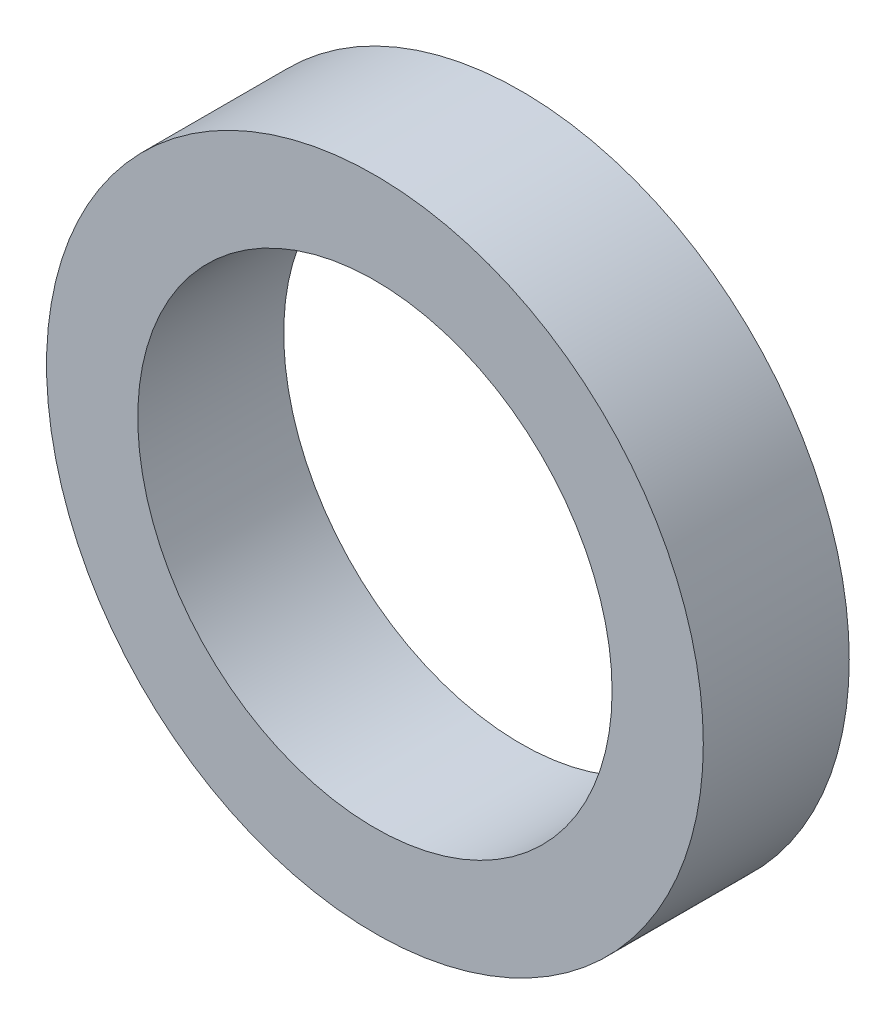
ISO-10303-21;
HEADER;
FILE_DESCRIPTION(('STEP AP214'),'2;1');
FILE_NAME('part.step','',(''),(''),'','','');
FILE_SCHEMA(('AUTOMOTIVE_DESIGN { 1 0 10303 214 1 1 1 1 }'));
ENDSEC;
DATA;
#1=APPLICATION_CONTEXT('core data for automotive mechanical design processes');
#2=APPLICATION_PROTOCOL_DEFINITION('international standard','automotive_design',2000,#1);
#3=PRODUCT_CONTEXT('',#1,'mechanical');
#4=PRODUCT('Part','Part','',(#3));
#5=PRODUCT_RELATED_PRODUCT_CATEGORY('part','',(#4));
#6=PRODUCT_DEFINITION_FORMATION('','',#4);
#7=PRODUCT_DEFINITION_CONTEXT('part definition',#1,'design');
#8=PRODUCT_DEFINITION('design','',#6,#7);
#9=PRODUCT_DEFINITION_SHAPE('','',#8);
#10=(LENGTH_UNIT() NAMED_UNIT(*) SI_UNIT(.MILLI.,.METRE.));
#11=(NAMED_UNIT(*) PLANE_ANGLE_UNIT() SI_UNIT($,.RADIAN.));
#12=(NAMED_UNIT(*) SI_UNIT($,.STERADIAN.) SOLID_ANGLE_UNIT());
#13=UNCERTAINTY_MEASURE_WITH_UNIT(LENGTH_MEASURE(1.E-05),#10,'distance_accuracy_value','');
#14=(GEOMETRIC_REPRESENTATION_CONTEXT(3) GLOBAL_UNCERTAINTY_ASSIGNED_CONTEXT((#13)) GLOBAL_UNIT_ASSIGNED_CONTEXT((#10,
#11,#12)) REPRESENTATION_CONTEXT('',''));
#15=CARTESIAN_POINT('',(0.,0.,0.));
#16=DIRECTION('',(0.,0.,1.));
#17=DIRECTION('',(1.,0.,0.));
#18=AXIS2_PLACEMENT_3D('',#15,#16,#17);
#19=CARTESIAN_POINT('',(0.,0.,2.));
#20=DIRECTION('',(0.,0.,1.));
#21=DIRECTION('',(1.,0.,0.));
#22=AXIS2_PLACEMENT_3D('',#19,#20,#21);
#23=PLANE('',#22);
#24=CARTESIAN_POINT('',(0.,0.,2.));
#25=DIRECTION('',(0.,0.,1.));
#26=DIRECTION('',(1.,0.,0.));
#27=AXIS2_PLACEMENT_3D('',#24,#25,#26);
#28=CIRCLE('',#27,4.5);
#29=CARTESIAN_POINT('',(4.5,0.,2.));
#30=VERTEX_POINT('',#29);
#31=EDGE_CURVE('E10',#30,#30,#28,.T.);
#32=ORIENTED_EDGE('',*,*,#31,.T.);
#33=EDGE_LOOP('',(#32));
#34=FACE_BOUND('',#33,.T.);
#35=CARTESIAN_POINT('',(0.,0.,2.));
#36=DIRECTION('',(0.,0.,1.));
#37=DIRECTION('',(1.,0.,0.));
#38=AXIS2_PLACEMENT_3D('',#35,#36,#37);
#39=CIRCLE('',#38,3.25);
#40=CARTESIAN_POINT('',(3.25,0.,2.));
#41=VERTEX_POINT('',#40);
#42=EDGE_CURVE('E42',#41,#41,#39,.T.);
#43=ORIENTED_EDGE('',*,*,#42,.F.);
#44=EDGE_LOOP('',(#43));
#45=FACE_BOUND('',#44,.T.);
#46=ADVANCED_FACE('F31',(#34,#45),#23,.T.);
#47=CARTESIAN_POINT('',(0.,0.,0.));
#48=DIRECTION('',(0.,0.,1.));
#49=DIRECTION('',(1.,0.,0.));
#50=AXIS2_PLACEMENT_3D('',#47,#48,#49);
#51=PLANE('',#50);
#52=CARTESIAN_POINT('',(0.,0.,0.));
#53=DIRECTION('',(0.,0.,1.));
#54=DIRECTION('',(1.,0.,0.));
#55=AXIS2_PLACEMENT_3D('',#52,#53,#54);
#56=CIRCLE('',#55,4.5);
#57=CARTESIAN_POINT('',(4.5,0.,0.));
#58=VERTEX_POINT('',#57);
#59=EDGE_CURVE('E35',#58,#58,#56,.T.);
#60=ORIENTED_EDGE('',*,*,#59,.F.);
#61=EDGE_LOOP('',(#60));
#62=FACE_BOUND('',#61,.T.);
#63=CARTESIAN_POINT('',(0.,0.,0.));
#64=DIRECTION('',(0.,0.,1.));
#65=DIRECTION('',(1.,0.,0.));
#66=AXIS2_PLACEMENT_3D('',#63,#64,#65);
#67=CIRCLE('',#66,3.25);
#68=CARTESIAN_POINT('',(3.25,0.,0.));
#69=VERTEX_POINT('',#68);
#70=EDGE_CURVE('E44',#69,#69,#67,.T.);
#71=ORIENTED_EDGE('',*,*,#70,.T.);
#72=EDGE_LOOP('',(#71));
#73=FACE_BOUND('',#72,.T.);
#74=ADVANCED_FACE('F54',(#62,#73),#51,.F.);
#75=CARTESIAN_POINT('',(0.,0.,2.));
#76=DIRECTION('',(0.,0.,-1.));
#77=DIRECTION('',(-1.,0.,0.));
#78=AXIS2_PLACEMENT_3D('',#75,#76,#77);
#79=CYLINDRICAL_SURFACE('',#78,4.5);
#80=ORIENTED_EDGE('',*,*,#31,.F.);
#81=EDGE_LOOP('',(#80));
#82=FACE_BOUND('',#81,.T.);
#83=ORIENTED_EDGE('',*,*,#59,.T.);
#84=EDGE_LOOP('',(#83));
#85=FACE_BOUND('',#84,.T.);
#86=ADVANCED_FACE('F33',(#82,#85),#79,.T.);
#87=CARTESIAN_POINT('',(0.,0.,2.));
#88=DIRECTION('',(0.,0.,-1.));
#89=DIRECTION('',(-1.,0.,0.));
#90=AXIS2_PLACEMENT_3D('',#87,#88,#89);
#91=CYLINDRICAL_SURFACE('',#90,3.25);
#92=ORIENTED_EDGE('',*,*,#42,.T.);
#93=EDGE_LOOP('',(#92));
#94=FACE_BOUND('',#93,.T.);
#95=ORIENTED_EDGE('',*,*,#70,.F.);
#96=EDGE_LOOP('',(#95));
#97=FACE_BOUND('',#96,.T.);
#98=ADVANCED_FACE('F50',(#94,#97),#91,.F.);
#99=CLOSED_SHELL('',(#46,#74,#86,#98));
#100=MANIFOLD_SOLID_BREP('B2',#99);
#101=ADVANCED_BREP_SHAPE_REPRESENTATION('',(#18,#100),#14);
#102=SHAPE_DEFINITION_REPRESENTATION(#9,#101);
ENDSEC;
END-ISO-10303-21;
